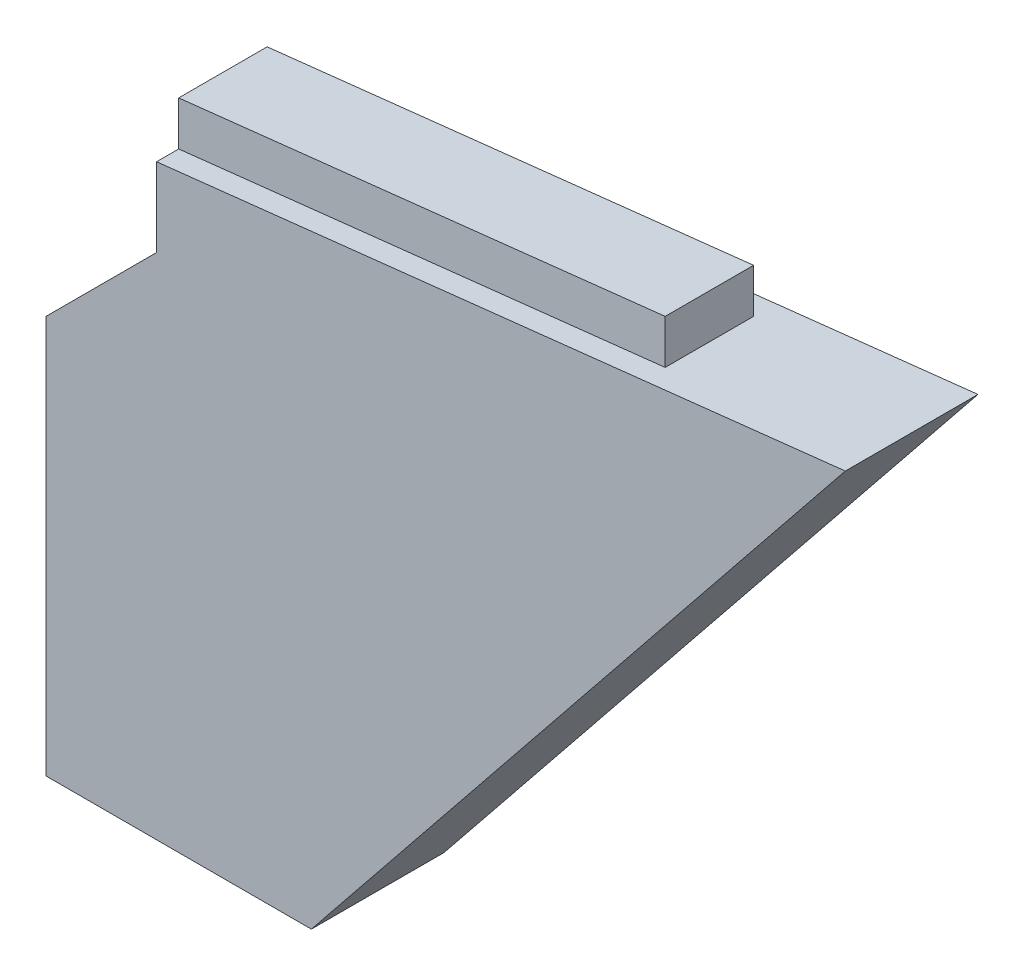
ISO-10303-21;
HEADER;
FILE_DESCRIPTION(('STEP AP214'),'2;1');
FILE_NAME('part.step','',(''),(''),'','','');
FILE_SCHEMA(('AUTOMOTIVE_DESIGN { 1 0 10303 214 1 1 1 1 }'));
ENDSEC;
DATA;
#1=APPLICATION_CONTEXT('core data for automotive mechanical design processes');
#2=APPLICATION_PROTOCOL_DEFINITION('international standard','automotive_design',2000,#1);
#3=PRODUCT_CONTEXT('',#1,'mechanical');
#4=PRODUCT('Part','Part','',(#3));
#5=PRODUCT_RELATED_PRODUCT_CATEGORY('part','',(#4));
#6=PRODUCT_DEFINITION_FORMATION('','',#4);
#7=PRODUCT_DEFINITION_CONTEXT('part definition',#1,'design');
#8=PRODUCT_DEFINITION('design','',#6,#7);
#9=PRODUCT_DEFINITION_SHAPE('','',#8);
#10=(LENGTH_UNIT() NAMED_UNIT(*) SI_UNIT(.MILLI.,.METRE.));
#11=(NAMED_UNIT(*) PLANE_ANGLE_UNIT() SI_UNIT($,.RADIAN.));
#12=(NAMED_UNIT(*) SI_UNIT($,.STERADIAN.) SOLID_ANGLE_UNIT());
#13=UNCERTAINTY_MEASURE_WITH_UNIT(LENGTH_MEASURE(1.E-05),#10,'distance_accuracy_value','');
#14=(GEOMETRIC_REPRESENTATION_CONTEXT(3) GLOBAL_UNCERTAINTY_ASSIGNED_CONTEXT((#13)) GLOBAL_UNIT_ASSIGNED_CONTEXT((#10,
#11,#12)) REPRESENTATION_CONTEXT('',''));
#15=CARTESIAN_POINT('',(0.,0.,0.));
#16=DIRECTION('',(0.,0.,1.));
#17=DIRECTION('',(1.,0.,0.));
#18=AXIS2_PLACEMENT_3D('',#15,#16,#17);
#19=CARTESIAN_POINT('',(-39.5,0.,1.5));
#20=DIRECTION('',(1.,0.,0.));
#21=DIRECTION('',(0.,1.,0.));
#22=AXIS2_PLACEMENT_3D('',#19,#20,#21);
#23=PLANE('',#22);
#24=DIRECTION('',(0.,0.,1.));
#25=VECTOR('',#24,1.);
#26=CARTESIAN_POINT('',(-39.5,-6.22222222222223,-1.));
#27=LINE('',#26,#25);
#28=CARTESIAN_POINT('',(-39.5,-6.22222222222223,-1.));
#29=VERTEX_POINT('',#28);
#30=CARTESIAN_POINT('',(-39.5,-6.22222222222223,1.));
#31=VERTEX_POINT('',#30);
#32=EDGE_CURVE('E225',#29,#31,#27,.T.);
#33=ORIENTED_EDGE('',*,*,#32,.F.);
#34=DIRECTION('',(0.,-1.,0.));
#35=VECTOR('',#34,1.);
#36=CARTESIAN_POINT('',(-39.5,0.,-1.));
#37=LINE('',#36,#35);
#38=CARTESIAN_POINT('',(-39.5,-7.22222222222223,-1.));
#39=VERTEX_POINT('',#38);
#40=EDGE_CURVE('E188',#29,#39,#37,.T.);
#41=ORIENTED_EDGE('',*,*,#40,.T.);
#42=DIRECTION('',(0.,0.,1.));
#43=VECTOR('',#42,1.);
#44=CARTESIAN_POINT('',(-39.5,-7.22222222222223,-3.5));
#45=LINE('',#44,#43);
#46=CARTESIAN_POINT('',(-39.5,-7.22222222222223,-1.5));
#47=VERTEX_POINT('',#46);
#48=EDGE_CURVE('E201',#47,#39,#45,.T.);
#49=ORIENTED_EDGE('',*,*,#48,.F.);
#50=DIRECTION('',(0.,-1.,0.));
#51=VECTOR('',#50,1.);
#52=CARTESIAN_POINT('',(-39.5,0.,-1.5));
#53=LINE('',#52,#51);
#54=CARTESIAN_POINT('',(-39.5,-9.00000000000002,-1.5));
#55=VERTEX_POINT('',#54);
#56=EDGE_CURVE('E168',#47,#55,#53,.T.);
#57=ORIENTED_EDGE('',*,*,#56,.T.);
#58=DIRECTION('',(0.,0.,-1.));
#59=VECTOR('',#58,1.);
#60=CARTESIAN_POINT('',(-39.5,-9.00000000000002,1.5));
#61=LINE('',#60,#59);
#62=CARTESIAN_POINT('',(-39.5,-9.00000000000002,1.5));
#63=VERTEX_POINT('',#62);
#64=EDGE_CURVE('E11',#63,#55,#61,.T.);
#65=ORIENTED_EDGE('',*,*,#64,.F.);
#66=DIRECTION('',(0.,-1.,0.));
#67=VECTOR('',#66,1.);
#68=CARTESIAN_POINT('',(-39.5,0.,1.5));
#69=LINE('',#68,#67);
#70=CARTESIAN_POINT('',(-39.5,-7.22222222222223,1.5));
#71=VERTEX_POINT('',#70);
#72=EDGE_CURVE('E146',#71,#63,#69,.T.);
#73=ORIENTED_EDGE('',*,*,#72,.F.);
#74=DIRECTION('',(0.,0.,-1.));
#75=VECTOR('',#74,1.);
#76=CARTESIAN_POINT('',(-39.5,-7.22222222222223,3.5));
#77=LINE('',#76,#75);
#78=CARTESIAN_POINT('',(-39.5,-7.22222222222223,1.));
#79=VERTEX_POINT('',#78);
#80=EDGE_CURVE('E209',#71,#79,#77,.T.);
#81=ORIENTED_EDGE('',*,*,#80,.T.);
#82=DIRECTION('',(0.,-1.,0.));
#83=VECTOR('',#82,1.);
#84=CARTESIAN_POINT('',(-39.5,0.,1.));
#85=LINE('',#84,#83);
#86=EDGE_CURVE('E187',#31,#79,#85,.T.);
#87=ORIENTED_EDGE('',*,*,#86,.F.);
#88=EDGE_LOOP('',(#33,#41,#49,#57,#65,#73,#81,#87));
#89=FACE_BOUND('',#88,.T.);
#90=ADVANCED_FACE('F44',(#89),#23,.F.);
#91=CARTESIAN_POINT('',(-28.5,0.,1.));
#92=DIRECTION('',(1.,0.,0.));
#93=DIRECTION('',(0.,1.,0.));
#94=AXIS2_PLACEMENT_3D('',#91,#92,#93);
#95=PLANE('',#94);
#96=DIRECTION('',(0.,-1.,0.));
#97=VECTOR('',#96,1.);
#98=CARTESIAN_POINT('',(-28.5,0.,-1.));
#99=LINE('',#98,#97);
#100=CARTESIAN_POINT('',(-28.5,-5.00000000000002,-1.));
#101=VERTEX_POINT('',#100);
#102=CARTESIAN_POINT('',(-28.5,-6.00000000000001,-1.));
#103=VERTEX_POINT('',#102);
#104=EDGE_CURVE('E184',#101,#103,#99,.T.);
#105=ORIENTED_EDGE('',*,*,#104,.F.);
#106=DIRECTION('',(0.,0.,-1.));
#107=VECTOR('',#106,1.);
#108=CARTESIAN_POINT('',(-28.5,-5.00000000000002,-1.));
#109=LINE('',#108,#107);
#110=CARTESIAN_POINT('',(-28.5,-5.00000000000002,1.));
#111=VERTEX_POINT('',#110);
#112=EDGE_CURVE('E67',#111,#101,#109,.T.);
#113=ORIENTED_EDGE('',*,*,#112,.F.);
#114=DIRECTION('',(0.,-1.,0.));
#115=VECTOR('',#114,1.);
#116=CARTESIAN_POINT('',(-28.5,0.,1.));
#117=LINE('',#116,#115);
#118=CARTESIAN_POINT('',(-28.5,-6.00000000000001,1.));
#119=VERTEX_POINT('',#118);
#120=EDGE_CURVE('E183',#111,#119,#117,.T.);
#121=ORIENTED_EDGE('',*,*,#120,.T.);
#122=DIRECTION('',(0.,0.,-1.));
#123=VECTOR('',#122,1.);
#124=CARTESIAN_POINT('',(-28.5,-6.00000000000001,1.));
#125=LINE('',#124,#123);
#126=EDGE_CURVE('E171',#119,#103,#125,.T.);
#127=ORIENTED_EDGE('',*,*,#126,.T.);
#128=EDGE_LOOP('',(#105,#113,#121,#127));
#129=FACE_BOUND('',#128,.T.);
#130=ADVANCED_FACE('F249',(#129),#95,.T.);
#131=CARTESIAN_POINT('',(0.,0.,1.));
#132=DIRECTION('',(0.,0.,1.));
#133=DIRECTION('',(1.,0.,0.));
#134=AXIS2_PLACEMENT_3D('',#131,#132,#133);
#135=PLANE('',#134);
#136=ORIENTED_EDGE('',*,*,#120,.F.);
#137=DIRECTION('',(0.993883734673619,0.110431526074846,0.));
#138=VECTOR('',#137,1.);
#139=CARTESIAN_POINT('',(-39.5,-6.22222222222223,1.));
#140=LINE('',#139,#138);
#141=EDGE_CURVE('E222',#31,#111,#140,.T.);
#142=ORIENTED_EDGE('',*,*,#141,.F.);
#143=ORIENTED_EDGE('',*,*,#86,.T.);
#144=DIRECTION('',(-0.993883734673619,-0.110431526074846,0.));
#145=VECTOR('',#144,1.);
#146=CARTESIAN_POINT('',(0.310975609756099,-2.7987804878049,1.));
#147=LINE('',#146,#145);
#148=EDGE_CURVE('E213',#119,#79,#147,.T.);
#149=ORIENTED_EDGE('',*,*,#148,.F.);
#150=EDGE_LOOP('',(#136,#142,#143,#149));
#151=FACE_BOUND('',#150,.T.);
#152=ADVANCED_FACE('F255',(#151),#135,.T.);
#153=CARTESIAN_POINT('',(0.,0.,-1.));
#154=DIRECTION('',(0.,0.,1.));
#155=DIRECTION('',(1.,0.,0.));
#156=AXIS2_PLACEMENT_3D('',#153,#154,#155);
#157=PLANE('',#156);
#158=DIRECTION('',(-0.993883734673619,-0.110431526074846,0.));
#159=VECTOR('',#158,1.);
#160=CARTESIAN_POINT('',(-39.5,-6.22222222222223,-1.));
#161=LINE('',#160,#159);
#162=EDGE_CURVE('E217',#101,#29,#161,.T.);
#163=ORIENTED_EDGE('',*,*,#162,.F.);
#164=ORIENTED_EDGE('',*,*,#104,.T.);
#165=DIRECTION('',(-0.993883734673619,-0.110431526074846,0.));
#166=VECTOR('',#165,1.);
#167=CARTESIAN_POINT('',(0.310975609756099,-2.7987804878049,-1.));
#168=LINE('',#167,#166);
#169=EDGE_CURVE('E205',#103,#39,#168,.T.);
#170=ORIENTED_EDGE('',*,*,#169,.T.);
#171=ORIENTED_EDGE('',*,*,#40,.F.);
#172=EDGE_LOOP('',(#163,#164,#170,#171));
#173=FACE_BOUND('',#172,.T.);
#174=ADVANCED_FACE('F246',(#173),#157,.F.);
#175=CARTESIAN_POINT('',(0.,0.,-1.5));
#176=DIRECTION('',(0.,0.,1.));
#177=DIRECTION('',(1.,0.,0.));
#178=AXIS2_PLACEMENT_3D('',#175,#176,#177);
#179=PLANE('',#178);
#180=DIRECTION('',(0.993883734673619,0.110431526074846,0.));
#181=VECTOR('',#180,1.);
#182=CARTESIAN_POINT('',(0.310975609756099,-2.7987804878049,-1.5));
#183=LINE('',#182,#181);
#184=CARTESIAN_POINT('',(-23.9264322514862,-5.4918258057207,-1.5));
#185=VERTEX_POINT('',#184);
#186=EDGE_CURVE('E138',#47,#185,#183,.T.);
#187=ORIENTED_EDGE('',*,*,#186,.T.);
#188=DIRECTION('',(0.626814609642534,0.779168431816047,0.));
#189=VECTOR('',#188,1.);
#190=CARTESIAN_POINT('',(-11.8436438180839,9.52781025698708,-1.5));
#191=LINE('',#190,#189);
#192=CARTESIAN_POINT('',(-36.,-20.5,-1.5));
#193=VERTEX_POINT('',#192);
#194=EDGE_CURVE('E59',#193,#185,#191,.T.);
#195=ORIENTED_EDGE('',*,*,#194,.F.);
#196=DIRECTION('',(1.,0.,0.));
#197=VECTOR('',#196,1.);
#198=CARTESIAN_POINT('',(0.,-20.5,-1.5));
#199=LINE('',#198,#197);
#200=CARTESIAN_POINT('',(-42.,-20.5,-1.5));
#201=VERTEX_POINT('',#200);
#202=EDGE_CURVE('E136',#201,#193,#199,.T.);
#203=ORIENTED_EDGE('',*,*,#202,.F.);
#204=DIRECTION('',(0.,-1.,0.));
#205=VECTOR('',#204,1.);
#206=CARTESIAN_POINT('',(-42.,0.,-1.5));
#207=LINE('',#206,#205);
#208=CARTESIAN_POINT('',(-42.,-11.5,-1.5));
#209=VERTEX_POINT('',#208);
#210=EDGE_CURVE('E147',#209,#201,#207,.T.);
#211=ORIENTED_EDGE('',*,*,#210,.F.);
#212=DIRECTION('',(-0.707106781186548,-0.707106781186547,0.));
#213=VECTOR('',#212,1.);
#214=CARTESIAN_POINT('',(-15.25,15.25,-1.5));
#215=LINE('',#214,#213);
#216=EDGE_CURVE('E153',#55,#209,#215,.T.);
#217=ORIENTED_EDGE('',*,*,#216,.F.);
#218=ORIENTED_EDGE('',*,*,#56,.F.);
#219=EDGE_LOOP('',(#187,#195,#203,#211,#217,#218));
#220=FACE_BOUND('',#219,.T.);
#221=ADVANCED_FACE('F134',(#220),#179,.F.);
#222=CARTESIAN_POINT('',(-15.25,15.25,1.5));
#223=DIRECTION('',(0.707106781186547,-0.707106781186548,0.));
#224=DIRECTION('',(0.707106781186548,0.707106781186547,0.));
#225=AXIS2_PLACEMENT_3D('',#222,#223,#224);
#226=PLANE('',#225);
#227=ORIENTED_EDGE('',*,*,#216,.T.);
#228=DIRECTION('',(0.,0.,-1.));
#229=VECTOR('',#228,1.);
#230=CARTESIAN_POINT('',(-42.,-11.5,1.5));
#231=LINE('',#230,#229);
#232=CARTESIAN_POINT('',(-42.,-11.5,1.5));
#233=VERTEX_POINT('',#232);
#234=EDGE_CURVE('E52',#233,#209,#231,.T.);
#235=ORIENTED_EDGE('',*,*,#234,.F.);
#236=DIRECTION('',(-0.707106781186548,-0.707106781186547,0.));
#237=VECTOR('',#236,1.);
#238=CARTESIAN_POINT('',(-15.25,15.25,1.5));
#239=LINE('',#238,#237);
#240=EDGE_CURVE('E151',#63,#233,#239,.T.);
#241=ORIENTED_EDGE('',*,*,#240,.F.);
#242=ORIENTED_EDGE('',*,*,#64,.T.);
#243=EDGE_LOOP('',(#227,#235,#241,#242));
#244=FACE_BOUND('',#243,.T.);
#245=ADVANCED_FACE('F239',(#244),#226,.F.);
#246=CARTESIAN_POINT('',(-42.,0.,1.5));
#247=DIRECTION('',(1.,0.,0.));
#248=DIRECTION('',(0.,1.,0.));
#249=AXIS2_PLACEMENT_3D('',#246,#247,#248);
#250=PLANE('',#249);
#251=ORIENTED_EDGE('',*,*,#210,.T.);
#252=DIRECTION('',(0.,0.,-1.));
#253=VECTOR('',#252,1.);
#254=CARTESIAN_POINT('',(-42.,-20.5,1.5));
#255=LINE('',#254,#253);
#256=CARTESIAN_POINT('',(-42.,-20.5,1.5));
#257=VERTEX_POINT('',#256);
#258=EDGE_CURVE('E128',#257,#201,#255,.T.);
#259=ORIENTED_EDGE('',*,*,#258,.F.);
#260=DIRECTION('',(0.,-1.,0.));
#261=VECTOR('',#260,1.);
#262=CARTESIAN_POINT('',(-42.,0.,1.5));
#263=LINE('',#262,#261);
#264=EDGE_CURVE('E164',#233,#257,#263,.T.);
#265=ORIENTED_EDGE('',*,*,#264,.F.);
#266=ORIENTED_EDGE('',*,*,#234,.T.);
#267=EDGE_LOOP('',(#251,#259,#265,#266));
#268=FACE_BOUND('',#267,.T.);
#269=ADVANCED_FACE('F163',(#268),#250,.F.);
#270=CARTESIAN_POINT('',(0.,-20.5,1.5));
#271=DIRECTION('',(0.,1.,0.));
#272=DIRECTION('',(-1.,0.,0.));
#273=AXIS2_PLACEMENT_3D('',#270,#271,#272);
#274=PLANE('',#273);
#275=ORIENTED_EDGE('',*,*,#202,.T.);
#276=DIRECTION('',(0.,0.,-1.));
#277=VECTOR('',#276,1.);
#278=CARTESIAN_POINT('',(-36.,-20.5,1.5));
#279=LINE('',#278,#277);
#280=CARTESIAN_POINT('',(-36.,-20.5,1.5));
#281=VERTEX_POINT('',#280);
#282=EDGE_CURVE('E119',#281,#193,#279,.T.);
#283=ORIENTED_EDGE('',*,*,#282,.F.);
#284=DIRECTION('',(1.,0.,0.));
#285=VECTOR('',#284,1.);
#286=CARTESIAN_POINT('',(0.,-20.5,1.5));
#287=LINE('',#286,#285);
#288=EDGE_CURVE('E129',#257,#281,#287,.T.);
#289=ORIENTED_EDGE('',*,*,#288,.F.);
#290=ORIENTED_EDGE('',*,*,#258,.T.);
#291=EDGE_LOOP('',(#275,#283,#289,#290));
#292=FACE_BOUND('',#291,.T.);
#293=ADVANCED_FACE('F143',(#292),#274,.F.);
#294=CARTESIAN_POINT('',(0.,0.,1.5));
#295=DIRECTION('',(0.,0.,1.));
#296=DIRECTION('',(1.,0.,0.));
#297=AXIS2_PLACEMENT_3D('',#294,#295,#296);
#298=PLANE('',#297);
#299=DIRECTION('',(-0.626814609642534,-0.779168431816047,0.));
#300=VECTOR('',#299,1.);
#301=CARTESIAN_POINT('',(-11.8436438180839,9.52781025698708,1.5));
#302=LINE('',#301,#300);
#303=CARTESIAN_POINT('',(-23.9264322514862,-5.4918258057207,1.5));
#304=VERTEX_POINT('',#303);
#305=EDGE_CURVE('E122',#304,#281,#302,.T.);
#306=ORIENTED_EDGE('',*,*,#305,.F.);
#307=DIRECTION('',(0.993883734673619,0.110431526074846,0.));
#308=VECTOR('',#307,1.);
#309=CARTESIAN_POINT('',(0.310975609756099,-2.7987804878049,1.5));
#310=LINE('',#309,#308);
#311=EDGE_CURVE('E197',#71,#304,#310,.T.);
#312=ORIENTED_EDGE('',*,*,#311,.F.);
#313=ORIENTED_EDGE('',*,*,#72,.T.);
#314=ORIENTED_EDGE('',*,*,#240,.T.);
#315=ORIENTED_EDGE('',*,*,#264,.T.);
#316=ORIENTED_EDGE('',*,*,#288,.T.);
#317=EDGE_LOOP('',(#306,#312,#313,#314,#315,#316));
#318=FACE_BOUND('',#317,.T.);
#319=ADVANCED_FACE('F236',(#318),#298,.T.);
#320=CARTESIAN_POINT('',(0.310975609756099,-2.7987804878049,-1.5));
#321=DIRECTION('',(0.110431526074846,-0.993883734673619,0.));
#322=DIRECTION('',(0.993883734673619,0.110431526074846,0.));
#323=AXIS2_PLACEMENT_3D('',#320,#321,#322);
#324=PLANE('',#323);
#325=ORIENTED_EDGE('',*,*,#311,.T.);
#326=DIRECTION('',(0.,0.,-1.));
#327=VECTOR('',#326,1.);
#328=CARTESIAN_POINT('',(-23.9264322514862,-5.4918258057207,4.5));
#329=LINE('',#328,#327);
#330=EDGE_CURVE('E140',#304,#185,#329,.T.);
#331=ORIENTED_EDGE('',*,*,#330,.T.);
#332=ORIENTED_EDGE('',*,*,#186,.F.);
#333=ORIENTED_EDGE('',*,*,#48,.T.);
#334=ORIENTED_EDGE('',*,*,#169,.F.);
#335=ORIENTED_EDGE('',*,*,#126,.F.);
#336=ORIENTED_EDGE('',*,*,#148,.T.);
#337=ORIENTED_EDGE('',*,*,#80,.F.);
#338=EDGE_LOOP('',(#325,#331,#332,#333,#334,#335,#336,#337));
#339=FACE_BOUND('',#338,.T.);
#340=ADVANCED_FACE('F232',(#339),#324,.F.);
#341=CARTESIAN_POINT('',(0.0914634146341453,-1.82317073170734,0.));
#342=DIRECTION('',(-0.110431526074846,0.993883734673619,0.));
#343=DIRECTION('',(-0.993883734673619,-0.110431526074846,0.));
#344=AXIS2_PLACEMENT_3D('',#341,#342,#343);
#345=PLANE('',#344);
#346=ORIENTED_EDGE('',*,*,#32,.T.);
#347=ORIENTED_EDGE('',*,*,#141,.T.);
#348=ORIENTED_EDGE('',*,*,#112,.T.);
#349=ORIENTED_EDGE('',*,*,#162,.T.);
#350=EDGE_LOOP('',(#346,#347,#348,#349));
#351=FACE_BOUND('',#350,.T.);
#352=ADVANCED_FACE('F256',(#351),#345,.T.);
#353=CARTESIAN_POINT('',(-11.8436438180839,9.52781025698708,4.5));
#354=DIRECTION('',(-0.779168431816047,0.626814609642534,0.));
#355=DIRECTION('',(-0.626814609642534,-0.779168431816047,0.));
#356=AXIS2_PLACEMENT_3D('',#353,#354,#355);
#357=PLANE('',#356);
#358=ORIENTED_EDGE('',*,*,#305,.T.);
#359=ORIENTED_EDGE('',*,*,#282,.T.);
#360=ORIENTED_EDGE('',*,*,#194,.T.);
#361=ORIENTED_EDGE('',*,*,#330,.F.);
#362=EDGE_LOOP('',(#358,#359,#360,#361));
#363=FACE_BOUND('',#362,.T.);
#364=ADVANCED_FACE('F120',(#363),#357,.F.);
#365=CLOSED_SHELL('',(#90,#130,#152,#174,#221,#245,#269,#293,#319,#340,#352,#364));
#366=MANIFOLD_SOLID_BREP('B2',#365);
#367=ADVANCED_BREP_SHAPE_REPRESENTATION('',(#18,#366),#14);
#368=SHAPE_DEFINITION_REPRESENTATION(#9,#367);
ENDSEC;
END-ISO-10303-21;
